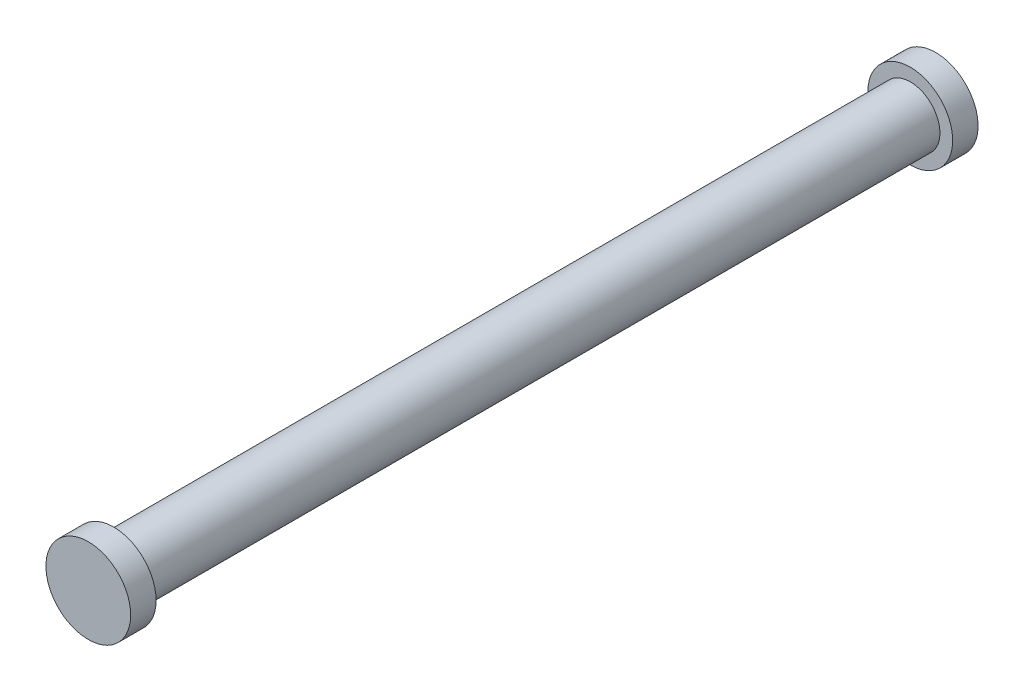
ISO-10303-21;
HEADER;
FILE_DESCRIPTION(('STEP AP214'),'2;1');
FILE_NAME('part.step','',(''),(''),'','','');
FILE_SCHEMA(('AUTOMOTIVE_DESIGN { 1 0 10303 214 1 1 1 1 }'));
ENDSEC;
DATA;
#1=APPLICATION_CONTEXT('core data for automotive mechanical design processes');
#2=APPLICATION_PROTOCOL_DEFINITION('international standard','automotive_design',2000,#1);
#3=PRODUCT_CONTEXT('',#1,'mechanical');
#4=PRODUCT('Part','Part','',(#3));
#5=PRODUCT_RELATED_PRODUCT_CATEGORY('part','',(#4));
#6=PRODUCT_DEFINITION_FORMATION('','',#4);
#7=PRODUCT_DEFINITION_CONTEXT('part definition',#1,'design');
#8=PRODUCT_DEFINITION('design','',#6,#7);
#9=PRODUCT_DEFINITION_SHAPE('','',#8);
#10=(LENGTH_UNIT() NAMED_UNIT(*) SI_UNIT(.MILLI.,.METRE.));
#11=(NAMED_UNIT(*) PLANE_ANGLE_UNIT() SI_UNIT($,.RADIAN.));
#12=(NAMED_UNIT(*) SI_UNIT($,.STERADIAN.) SOLID_ANGLE_UNIT());
#13=UNCERTAINTY_MEASURE_WITH_UNIT(LENGTH_MEASURE(1.E-05),#10,'distance_accuracy_value','');
#14=(GEOMETRIC_REPRESENTATION_CONTEXT(3) GLOBAL_UNCERTAINTY_ASSIGNED_CONTEXT((#13)) GLOBAL_UNIT_ASSIGNED_CONTEXT((#10,
#11,#12)) REPRESENTATION_CONTEXT('',''));
#15=CARTESIAN_POINT('',(0.,0.,0.));
#16=DIRECTION('',(0.,0.,1.));
#17=DIRECTION('',(1.,0.,0.));
#18=AXIS2_PLACEMENT_3D('',#15,#16,#17);
#19=CARTESIAN_POINT('',(600.,170.,-98.9949493661166));
#20=DIRECTION('',(0.,0.,1.));
#21=DIRECTION('',(1.,0.,0.));
#22=AXIS2_PLACEMENT_3D('',#19,#20,#21);
#23=CYLINDRICAL_SURFACE('',#22,35.);
#24=CARTESIAN_POINT('',(600.,170.,970.));
#25=DIRECTION('',(0.,0.,1.));
#26=DIRECTION('',(1.,0.,0.));
#27=AXIS2_PLACEMENT_3D('',#24,#25,#26);
#28=CIRCLE('',#27,35.);
#29=CARTESIAN_POINT('',(635.,170.,970.));
#30=VERTEX_POINT('',#29);
#31=EDGE_CURVE('E10',#30,#30,#28,.F.);
#32=CARTESIAN_POINT('',(600.,170.,30.));
#33=DIRECTION('',(0.,0.,-1.));
#34=DIRECTION('',(-1.,0.,0.));
#35=AXIS2_PLACEMENT_3D('',#32,#33,#34);
#36=CIRCLE('',#35,35.);
#37=CARTESIAN_POINT('',(635.,170.,30.));
#38=VERTEX_POINT('',#37);
#39=EDGE_CURVE('E43',#38,#38,#36,.F.);
#40=CARTESIAN_POINT('',(635.,170.,970.));
#41=CARTESIAN_POINT('',(635.,170.,960.208333333333));
#42=CARTESIAN_POINT('',(635.,170.,950.416666666667));
#43=CARTESIAN_POINT('',(635.,170.,930.833333333333));
#44=CARTESIAN_POINT('',(635.,170.,921.041666666667));
#45=CARTESIAN_POINT('',(635.,170.,901.458333333333));
#46=CARTESIAN_POINT('',(635.,170.,891.666666666667));
#47=CARTESIAN_POINT('',(635.,170.,872.083333333333));
#48=CARTESIAN_POINT('',(635.,170.,862.291666666667));
#49=CARTESIAN_POINT('',(635.,170.,842.708333333333));
#50=CARTESIAN_POINT('',(635.,170.,832.916666666667));
#51=CARTESIAN_POINT('',(635.,170.,813.333333333333));
#52=CARTESIAN_POINT('',(635.,170.,803.541666666667));
#53=CARTESIAN_POINT('',(635.,170.,783.958333333333));
#54=CARTESIAN_POINT('',(635.,170.,774.166666666667));
#55=CARTESIAN_POINT('',(635.,170.,754.583333333333));
#56=CARTESIAN_POINT('',(635.,170.,744.791666666667));
#57=CARTESIAN_POINT('',(635.,170.,725.208333333333));
#58=CARTESIAN_POINT('',(635.,170.,715.416666666667));
#59=CARTESIAN_POINT('',(635.,170.,695.833333333333));
#60=CARTESIAN_POINT('',(635.,170.,686.041666666667));
#61=CARTESIAN_POINT('',(635.,170.,666.458333333333));
#62=CARTESIAN_POINT('',(635.,170.,656.666666666667));
#63=CARTESIAN_POINT('',(635.,170.,637.083333333333));
#64=CARTESIAN_POINT('',(635.,170.,627.291666666667));
#65=CARTESIAN_POINT('',(635.,170.,607.708333333333));
#66=CARTESIAN_POINT('',(635.,170.,597.916666666667));
#67=CARTESIAN_POINT('',(635.,170.,578.333333333333));
#68=CARTESIAN_POINT('',(635.,170.,568.541666666667));
#69=CARTESIAN_POINT('',(635.,170.,548.958333333333));
#70=CARTESIAN_POINT('',(635.,170.,539.166666666667));
#71=CARTESIAN_POINT('',(635.,170.,519.583333333333));
#72=CARTESIAN_POINT('',(635.,170.,509.791666666667));
#73=CARTESIAN_POINT('',(635.,170.,490.208333333333));
#74=CARTESIAN_POINT('',(635.,170.,480.416666666667));
#75=CARTESIAN_POINT('',(635.,170.,460.833333333333));
#76=CARTESIAN_POINT('',(635.,170.,451.041666666667));
#77=CARTESIAN_POINT('',(635.,170.,431.458333333333));
#78=CARTESIAN_POINT('',(635.,170.,421.666666666667));
#79=CARTESIAN_POINT('',(635.,170.,402.083333333333));
#80=CARTESIAN_POINT('',(635.,170.,392.291666666667));
#81=CARTESIAN_POINT('',(635.,170.,372.708333333333));
#82=CARTESIAN_POINT('',(635.,170.,362.916666666667));
#83=CARTESIAN_POINT('',(635.,170.,343.333333333333));
#84=CARTESIAN_POINT('',(635.,170.,333.541666666667));
#85=CARTESIAN_POINT('',(635.,170.,313.958333333333));
#86=CARTESIAN_POINT('',(635.,170.,304.166666666667));
#87=CARTESIAN_POINT('',(635.,170.,284.583333333333));
#88=CARTESIAN_POINT('',(635.,170.,274.791666666667));
#89=CARTESIAN_POINT('',(635.,170.,255.208333333333));
#90=CARTESIAN_POINT('',(635.,170.,245.416666666667));
#91=CARTESIAN_POINT('',(635.,170.,225.833333333333));
#92=CARTESIAN_POINT('',(635.,170.,216.041666666667));
#93=CARTESIAN_POINT('',(635.,170.,196.458333333333));
#94=CARTESIAN_POINT('',(635.,170.,186.666666666667));
#95=CARTESIAN_POINT('',(635.,170.,167.083333333333));
#96=CARTESIAN_POINT('',(635.,170.,157.291666666667));
#97=CARTESIAN_POINT('',(635.,170.,137.708333333333));
#98=CARTESIAN_POINT('',(635.,170.,127.916666666667));
#99=CARTESIAN_POINT('',(635.,170.,108.333333333333));
#100=CARTESIAN_POINT('',(635.,170.,98.5416666666667));
#101=CARTESIAN_POINT('',(635.,170.,78.9583333333333));
#102=CARTESIAN_POINT('',(635.,170.,69.1666666666667));
#103=CARTESIAN_POINT('',(635.,170.,49.5833333333334));
#104=CARTESIAN_POINT('',(635.,170.,39.7916666666667));
#105=CARTESIAN_POINT('',(635.,170.,30.));
#106=B_SPLINE_CURVE_WITH_KNOTS('',3,(#40,#41,#42,#43,#44,#45,#46,#47,#48,#49,#50,#51,#52,#53,
#54,#55,#56,#57,#58,#59,#60,#61,#62,#63,#64,#65,#66,#67,#68,#69,#70,#71,#72,#73,#74,#75,#76,#77,
#78,#79,#80,#81,#82,#83,#84,#85,#86,#87,#88,#89,#90,#91,#92,#93,#94,#95,#96,#97,#98,#99,#100,
#101,#102,#103,#104,#105),.UNSPECIFIED.,.F.,.F.,(4,2,2,2,2,2,2,2,2,2,2,2,2,2,2,2,2,2,2,2,2,2,2,
2,2,2,2,2,2,2,2,2,4),(0.,29.3749999999999,58.7500000000001,88.1249999999999,117.5,146.875,
176.25,205.625,235.,264.375,293.75,323.125,352.5,381.875,411.25,440.625,470.,499.375,528.75,
558.125,587.5,616.875,646.25,675.625,705.,734.375,763.75,793.125,822.5,851.875,881.25,910.625,
940.),.UNSPECIFIED.);
#107=EDGE_CURVE('BSEAM39',#30,#38,#106,.T.);
#108=ORIENTED_EDGE('',*,*,#31,.T.);
#109=ORIENTED_EDGE('',*,*,#39,.T.);
#110=ORIENTED_EDGE('',*,*,#107,.T.);
#111=ORIENTED_EDGE('',*,*,#107,.F.);
#112=EDGE_LOOP('',(#108,#110,#109,#111));
#113=FACE_BOUND('',#112,.T.);
#114=ADVANCED_FACE('F39',(#113),#23,.T.);
#115=CARTESIAN_POINT('',(600.,170.,970.));
#116=DIRECTION('',(0.,0.,1.));
#117=DIRECTION('',(1.,0.,0.));
#118=AXIS2_PLACEMENT_3D('',#115,#116,#117);
#119=CYLINDRICAL_SURFACE('',#118,50.);
#120=CARTESIAN_POINT('',(600.,170.,970.));
#121=DIRECTION('',(0.,0.,1.));
#122=DIRECTION('',(1.,0.,0.));
#123=AXIS2_PLACEMENT_3D('',#120,#121,#122);
#124=CIRCLE('',#123,50.);
#125=CARTESIAN_POINT('',(650.,170.,970.));
#126=VERTEX_POINT('',#125);
#127=EDGE_CURVE('E47',#126,#126,#124,.T.);
#128=ORIENTED_EDGE('',*,*,#127,.T.);
#129=EDGE_LOOP('',(#128));
#130=FACE_BOUND('',#129,.T.);
#131=CARTESIAN_POINT('',(600.,170.,1000.));
#132=DIRECTION('',(0.,0.,1.));
#133=DIRECTION('',(1.,0.,0.));
#134=AXIS2_PLACEMENT_3D('',#131,#132,#133);
#135=CIRCLE('',#134,50.);
#136=CARTESIAN_POINT('',(650.,170.,1000.));
#137=VERTEX_POINT('',#136);
#138=EDGE_CURVE('E51',#137,#137,#135,.T.);
#139=ORIENTED_EDGE('',*,*,#138,.F.);
#140=EDGE_LOOP('',(#139));
#141=FACE_BOUND('',#140,.T.);
#142=ADVANCED_FACE('F80',(#130,#141),#119,.T.);
#143=CARTESIAN_POINT('',(600.,170.,970.));
#144=DIRECTION('',(0.,0.,1.));
#145=DIRECTION('',(1.,0.,0.));
#146=AXIS2_PLACEMENT_3D('',#143,#144,#145);
#147=PLANE('',#146);
#148=ORIENTED_EDGE('',*,*,#31,.F.);
#149=EDGE_LOOP('',(#148));
#150=FACE_BOUND('',#149,.T.);
#151=ORIENTED_EDGE('',*,*,#127,.F.);
#152=EDGE_LOOP('',(#151));
#153=FACE_BOUND('',#152,.T.);
#154=ADVANCED_FACE('F84',(#150,#153),#147,.F.);
#155=CARTESIAN_POINT('',(600.,170.,1000.));
#156=DIRECTION('',(0.,0.,1.));
#157=DIRECTION('',(1.,0.,0.));
#158=AXIS2_PLACEMENT_3D('',#155,#156,#157);
#159=PLANE('',#158);
#160=ORIENTED_EDGE('',*,*,#138,.T.);
#161=EDGE_LOOP('',(#160));
#162=FACE_BOUND('',#161,.T.);
#163=ADVANCED_FACE('F77',(#162),#159,.T.);
#164=CARTESIAN_POINT('',(600.,170.,30.));
#165=DIRECTION('',(0.,0.,-1.));
#166=DIRECTION('',(-1.,0.,0.));
#167=AXIS2_PLACEMENT_3D('',#164,#165,#166);
#168=CYLINDRICAL_SURFACE('',#167,50.);
#169=CARTESIAN_POINT('',(600.,170.,30.));
#170=DIRECTION('',(0.,0.,-1.));
#171=DIRECTION('',(-1.,0.,0.));
#172=AXIS2_PLACEMENT_3D('',#169,#170,#171);
#173=CIRCLE('',#172,50.);
#174=CARTESIAN_POINT('',(550.,170.,30.));
#175=VERTEX_POINT('',#174);
#176=EDGE_CURVE('E59',#175,#175,#173,.T.);
#177=ORIENTED_EDGE('',*,*,#176,.T.);
#178=EDGE_LOOP('',(#177));
#179=FACE_BOUND('',#178,.T.);
#180=CARTESIAN_POINT('',(600.,170.,0.));
#181=DIRECTION('',(0.,0.,-1.));
#182=DIRECTION('',(-1.,0.,0.));
#183=AXIS2_PLACEMENT_3D('',#180,#181,#182);
#184=CIRCLE('',#183,50.);
#185=CARTESIAN_POINT('',(550.,170.,0.));
#186=VERTEX_POINT('',#185);
#187=EDGE_CURVE('E56',#186,#186,#184,.T.);
#188=ORIENTED_EDGE('',*,*,#187,.F.);
#189=EDGE_LOOP('',(#188));
#190=FACE_BOUND('',#189,.T.);
#191=ADVANCED_FACE('F70',(#179,#190),#168,.T.);
#192=CARTESIAN_POINT('',(600.,170.,30.));
#193=DIRECTION('',(0.,0.,-1.));
#194=DIRECTION('',(-1.,0.,0.));
#195=AXIS2_PLACEMENT_3D('',#192,#193,#194);
#196=PLANE('',#195);
#197=ORIENTED_EDGE('',*,*,#39,.F.);
#198=EDGE_LOOP('',(#197));
#199=FACE_BOUND('',#198,.T.);
#200=ORIENTED_EDGE('',*,*,#176,.F.);
#201=EDGE_LOOP('',(#200));
#202=FACE_BOUND('',#201,.T.);
#203=ADVANCED_FACE('F67',(#199,#202),#196,.F.);
#204=CARTESIAN_POINT('',(0.,0.,0.));
#205=DIRECTION('',(0.,0.,-1.));
#206=DIRECTION('',(-1.,0.,0.));
#207=AXIS2_PLACEMENT_3D('',#204,#205,#206);
#208=PLANE('',#207);
#209=ORIENTED_EDGE('',*,*,#187,.T.);
#210=EDGE_LOOP('',(#209));
#211=FACE_BOUND('',#210,.T.);
#212=ADVANCED_FACE('F41',(#211),#208,.T.);
#213=CLOSED_SHELL('',(#114,#142,#154,#163,#191,#203,#212));
#214=MANIFOLD_SOLID_BREP('B2',#213);
#215=ADVANCED_BREP_SHAPE_REPRESENTATION('',(#18,#214),#14);
#216=SHAPE_DEFINITION_REPRESENTATION(#9,#215);
ENDSEC;
END-ISO-10303-21;
